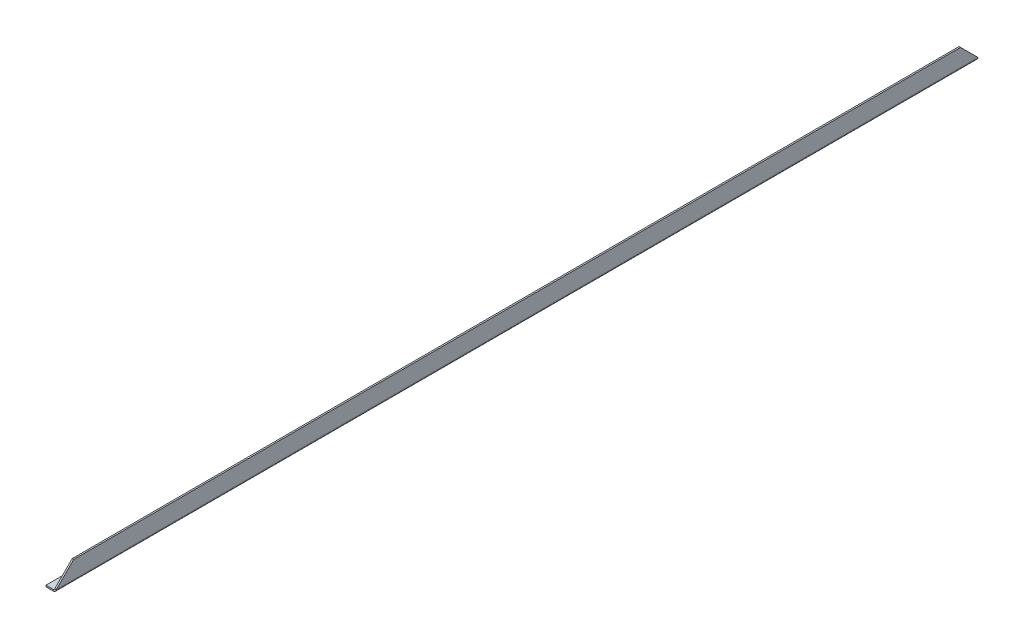
ISO-10303-21;
HEADER;
FILE_DESCRIPTION(('STEP AP214'),'2;1');
FILE_NAME('part.step','',(''),(''),'','','');
FILE_SCHEMA(('AUTOMOTIVE_DESIGN { 1 0 10303 214 1 1 1 1 }'));
ENDSEC;
DATA;
#1=APPLICATION_CONTEXT('core data for automotive mechanical design processes');
#2=APPLICATION_PROTOCOL_DEFINITION('international standard','automotive_design',2000,#1);
#3=PRODUCT_CONTEXT('',#1,'mechanical');
#4=PRODUCT('Part','Part','',(#3));
#5=PRODUCT_RELATED_PRODUCT_CATEGORY('part','',(#4));
#6=PRODUCT_DEFINITION_FORMATION('','',#4);
#7=PRODUCT_DEFINITION_CONTEXT('part definition',#1,'design');
#8=PRODUCT_DEFINITION('design','',#6,#7);
#9=PRODUCT_DEFINITION_SHAPE('','',#8);
#10=(LENGTH_UNIT() NAMED_UNIT(*) SI_UNIT(.MILLI.,.METRE.));
#11=(NAMED_UNIT(*) PLANE_ANGLE_UNIT() SI_UNIT($,.RADIAN.));
#12=(NAMED_UNIT(*) SI_UNIT($,.STERADIAN.) SOLID_ANGLE_UNIT());
#13=UNCERTAINTY_MEASURE_WITH_UNIT(LENGTH_MEASURE(1.E-05),#10,'distance_accuracy_value','');
#14=(GEOMETRIC_REPRESENTATION_CONTEXT(3) GLOBAL_UNCERTAINTY_ASSIGNED_CONTEXT((#13)) GLOBAL_UNIT_ASSIGNED_CONTEXT((#10,
#11,#12)) REPRESENTATION_CONTEXT('',''));
#15=CARTESIAN_POINT('',(0.,0.,0.));
#16=DIRECTION('',(0.,0.,1.));
#17=DIRECTION('',(1.,0.,0.));
#18=AXIS2_PLACEMENT_3D('',#15,#16,#17);
#19=CARTESIAN_POINT('',(1160.00000000001,652.732344202489,69.9999999999998));
#20=DIRECTION('',(1.,0.,0.));
#21=DIRECTION('',(0.,1.,0.));
#22=AXIS2_PLACEMENT_3D('',#19,#20,#21);
#23=PLANE('',#22);
#24=DIRECTION('',(0.,0.,1.));
#25=VECTOR('',#24,1.);
#26=CARTESIAN_POINT('',(1160.,-1198.5,-791.500000000001));
#27=LINE('',#26,#25);
#28=CARTESIAN_POINT('',(1160.,-1198.5,67.7928932188134));
#29=VERTEX_POINT('',#28);
#30=CARTESIAN_POINT('',(1160.,-1198.5,-857.792893218814));
#31=VERTEX_POINT('',#30);
#32=EDGE_CURVE('E170',#29,#31,#27,.F.);
#33=ORIENTED_EDGE('',*,*,#32,.F.);
#34=DIRECTION('',(0.,-1.,0.));
#35=VECTOR('',#34,1.);
#36=CARTESIAN_POINT('',(1160.00000000001,652.732344202489,67.7928932188134));
#37=LINE('',#36,#35);
#38=CARTESIAN_POINT('',(1160.,-1197.,67.7928932188134));
#39=VERTEX_POINT('',#38);
#40=EDGE_CURVE('E172',#39,#29,#37,.T.);
#41=ORIENTED_EDGE('',*,*,#40,.F.);
#42=DIRECTION('',(0.,0.,1.));
#43=VECTOR('',#42,1.);
#44=CARTESIAN_POINT('',(1160.,-1197.,69.9999999999998));
#45=LINE('',#44,#43);
#46=CARTESIAN_POINT('',(1160.,-1197.,-857.792893218814));
#47=VERTEX_POINT('',#46);
#48=EDGE_CURVE('E73',#47,#39,#45,.T.);
#49=ORIENTED_EDGE('',*,*,#48,.F.);
#50=DIRECTION('',(0.,-1.,0.));
#51=VECTOR('',#50,1.);
#52=CARTESIAN_POINT('',(1160.00000000001,652.732344202489,-857.792893218814));
#53=LINE('',#52,#51);
#54=EDGE_CURVE('E184',#47,#31,#53,.T.);
#55=ORIENTED_EDGE('',*,*,#54,.T.);
#56=EDGE_LOOP('',(#33,#41,#49,#55));
#57=FACE_BOUND('',#56,.T.);
#58=ADVANCED_FACE('F59',(#57),#23,.F.);
#59=CARTESIAN_POINT('',(1168.50000000001,652.732344202489,-857.792893218814));
#60=DIRECTION('',(0.,0.,-1.));
#61=DIRECTION('',(1.,0.,0.));
#62=AXIS2_PLACEMENT_3D('',#59,#60,#61);
#63=PLANE('',#62);
#64=CARTESIAN_POINT('',(1167.5,-1198.5,-857.792893218814));
#65=CARTESIAN_POINT('',(1167.5,-1197.,-857.792893218814));
#66=B_SPLINE_CURVE_WITH_KNOTS('',1,(#64,#65),.UNSPECIFIED.,.F.,.F.,(2,2),(0.,1.),.UNSPECIFIED.);
#67=CARTESIAN_POINT('',(1167.5,-1197.,-857.792893218814));
#68=VERTEX_POINT('',#67);
#69=CARTESIAN_POINT('',(1167.5,-1198.5,-857.792893218814));
#70=VERTEX_POINT('',#69);
#71=EDGE_CURVE('E176',#68,#70,#66,.F.);
#72=ORIENTED_EDGE('',*,*,#71,.T.);
#73=DIRECTION('',(1.,0.,0.));
#74=VECTOR('',#73,1.);
#75=CARTESIAN_POINT('',(-3.5527136788005E-12,-1198.5,-857.792893218814));
#76=LINE('',#75,#74);
#77=EDGE_CURVE('E118',#31,#70,#76,.T.);
#78=ORIENTED_EDGE('',*,*,#77,.F.);
#79=ORIENTED_EDGE('',*,*,#54,.F.);
#80=DIRECTION('',(-1.,0.,0.));
#81=VECTOR('',#80,1.);
#82=CARTESIAN_POINT('',(1168.5,-1197.,-857.792893218814));
#83=LINE('',#82,#81);
#84=EDGE_CURVE('E178',#47,#68,#83,.F.);
#85=ORIENTED_EDGE('',*,*,#84,.T.);
#86=EDGE_LOOP('',(#72,#78,#79,#85));
#87=FACE_BOUND('',#86,.T.);
#88=ADVANCED_FACE('F177',(#87),#63,.T.);
#89=CARTESIAN_POINT('',(-3.5527136788005E-12,-1198.5,-791.500000000001));
#90=DIRECTION('',(0.,-1.,0.));
#91=DIRECTION('',(1.,0.,0.));
#92=AXIS2_PLACEMENT_3D('',#89,#90,#91);
#93=PLANE('',#92);
#94=DIRECTION('',(1.,0.,0.));
#95=VECTOR('',#94,1.);
#96=CARTESIAN_POINT('',(-3.5527136788005E-12,-1198.5,67.7928932188134));
#97=LINE('',#96,#95);
#98=CARTESIAN_POINT('',(1167.5,-1198.5,67.7928932188134));
#99=VERTEX_POINT('',#98);
#100=EDGE_CURVE('E378',#99,#29,#97,.F.);
#101=ORIENTED_EDGE('',*,*,#100,.T.);
#102=ORIENTED_EDGE('',*,*,#32,.T.);
#103=ORIENTED_EDGE('',*,*,#77,.T.);
#104=DIRECTION('',(0.,0.,1.));
#105=VECTOR('',#104,1.);
#106=CARTESIAN_POINT('',(1167.5,-1198.5,67.7928932188134));
#107=LINE('',#106,#105);
#108=EDGE_CURVE('E108',#99,#70,#107,.F.);
#109=ORIENTED_EDGE('',*,*,#108,.F.);
#110=EDGE_LOOP('',(#101,#102,#103,#109));
#111=FACE_BOUND('',#110,.T.);
#112=ADVANCED_FACE('F168',(#111),#93,.T.);
#113=CARTESIAN_POINT('',(1168.50000000001,652.732344202489,67.7928932188134));
#114=DIRECTION('',(0.,0.,-1.));
#115=DIRECTION('',(1.,0.,0.));
#116=AXIS2_PLACEMENT_3D('',#113,#114,#115);
#117=PLANE('',#116);
#118=ORIENTED_EDGE('',*,*,#100,.F.);
#119=CARTESIAN_POINT('',(1167.5,-1197.,67.7928932188134));
#120=CARTESIAN_POINT('',(1167.5,-1198.5,67.7928932188134));
#121=B_SPLINE_CURVE_WITH_KNOTS('',1,(#119,#120),.UNSPECIFIED.,.F.,.F.,(2,2),(0.,1.),.UNSPECIFIED.);
#122=CARTESIAN_POINT('',(1167.5,-1197.,67.7928932188134));
#123=VERTEX_POINT('',#122);
#124=EDGE_CURVE('E197',#123,#99,#121,.T.);
#125=ORIENTED_EDGE('',*,*,#124,.F.);
#126=DIRECTION('',(-1.,0.,0.));
#127=VECTOR('',#126,1.);
#128=CARTESIAN_POINT('',(1168.5,-1197.,67.7928932188134));
#129=LINE('',#128,#127);
#130=EDGE_CURVE('E14',#39,#123,#129,.F.);
#131=ORIENTED_EDGE('',*,*,#130,.F.);
#132=ORIENTED_EDGE('',*,*,#40,.T.);
#133=EDGE_LOOP('',(#118,#125,#131,#132));
#134=FACE_BOUND('',#133,.T.);
#135=ADVANCED_FACE('F355',(#134),#117,.F.);
#136=CARTESIAN_POINT('',(-3.5527136788005E-12,-1197.,-791.500000000001));
#137=DIRECTION('',(0.,-1.,0.));
#138=DIRECTION('',(1.,0.,0.));
#139=AXIS2_PLACEMENT_3D('',#136,#137,#138);
#140=PLANE('',#139);
#141=DIRECTION('',(0.,0.,1.));
#142=VECTOR('',#141,1.);
#143=CARTESIAN_POINT('',(1167.5,-1197.,67.7928932188134));
#144=LINE('',#143,#142);
#145=EDGE_CURVE('E372',#123,#68,#144,.F.);
#146=ORIENTED_EDGE('',*,*,#145,.T.);
#147=ORIENTED_EDGE('',*,*,#84,.F.);
#148=ORIENTED_EDGE('',*,*,#48,.T.);
#149=ORIENTED_EDGE('',*,*,#130,.T.);
#150=EDGE_LOOP('',(#146,#147,#148,#149));
#151=FACE_BOUND('',#150,.T.);
#152=ADVANCED_FACE('F62',(#151),#140,.F.);
#153=CARTESIAN_POINT('',(1170.,0.,-791.500000000001));
#154=DIRECTION('',(-1.,0.,0.));
#155=DIRECTION('',(0.,-1.,0.));
#156=AXIS2_PLACEMENT_3D('',#153,#154,#155);
#157=PLANE('',#156);
#158=DIRECTION('',(0.,0.,1.));
#159=VECTOR('',#158,1.);
#160=CARTESIAN_POINT('',(1170.,-1178.5,-791.500000000001));
#161=LINE('',#160,#159);
#162=CARTESIAN_POINT('',(1170.,-1178.5,50.));
#163=VERTEX_POINT('',#162);
#164=CARTESIAN_POINT('',(1170.,-1178.5,-840.000000000001));
#165=VERTEX_POINT('',#164);
#166=EDGE_CURVE('E287',#163,#165,#161,.F.);
#167=ORIENTED_EDGE('',*,*,#166,.F.);
#168=DIRECTION('',(0.,-0.707106781186551,0.707106781186544));
#169=VECTOR('',#168,1.);
#170=CARTESIAN_POINT('',(1170.,-168.499999999994,-959.999999999996));
#171=LINE('',#170,#169);
#172=CARTESIAN_POINT('',(1170.,-1196.,67.4999999999999));
#173=VERTEX_POINT('',#172);
#174=EDGE_CURVE('E296',#163,#173,#171,.T.);
#175=ORIENTED_EDGE('',*,*,#174,.T.);
#176=DIRECTION('',(0.,0.,1.));
#177=VECTOR('',#176,1.);
#178=CARTESIAN_POINT('',(1170.,-1196.,-791.500000000001));
#179=LINE('',#178,#177);
#180=CARTESIAN_POINT('',(1170.,-1196.,-857.5));
#181=VERTEX_POINT('',#180);
#182=EDGE_CURVE('E401',#181,#173,#179,.T.);
#183=ORIENTED_EDGE('',*,*,#182,.F.);
#184=DIRECTION('',(0.,-0.707106781186554,-0.707106781186541));
#185=VECTOR('',#184,1.);
#186=CARTESIAN_POINT('',(1170.,-564.999999999989,-226.500000000001));
#187=LINE('',#186,#185);
#188=EDGE_CURVE('E308',#165,#181,#187,.T.);
#189=ORIENTED_EDGE('',*,*,#188,.F.);
#190=EDGE_LOOP('',(#167,#175,#183,#189));
#191=FACE_BOUND('',#190,.T.);
#192=ADVANCED_FACE('F345',(#191),#157,.F.);
#193=CARTESIAN_POINT('',(-680.33105146079,-168.499999999988,-959.999999999996));
#194=DIRECTION('',(0.,0.707106781186544,0.707106781186551));
#195=DIRECTION('',(0.,-0.707106781186551,0.707106781186544));
#196=AXIS2_PLACEMENT_3D('',#193,#194,#195);
#197=PLANE('',#196);
#198=ORIENTED_EDGE('',*,*,#174,.F.);
#199=DIRECTION('',(1.,0.,0.));
#200=VECTOR('',#199,1.);
#201=CARTESIAN_POINT('',(-680.331051460793,-1178.49999999999,50.));
#202=LINE('',#201,#200);
#203=CARTESIAN_POINT('',(1168.5,-1178.5,50.));
#204=VERTEX_POINT('',#203);
#205=EDGE_CURVE('E303',#204,#163,#202,.T.);
#206=ORIENTED_EDGE('',*,*,#205,.F.);
#207=DIRECTION('',(0.,-0.707106781186551,0.707106781186544));
#208=VECTOR('',#207,1.);
#209=CARTESIAN_POINT('',(1168.5,-168.499999999994,-959.999999999996));
#210=LINE('',#209,#208);
#211=CARTESIAN_POINT('',(1168.5,-1196.,67.4999999999999));
#212=VERTEX_POINT('',#211);
#213=EDGE_CURVE('E299',#204,#212,#210,.T.);
#214=ORIENTED_EDGE('',*,*,#213,.T.);
#215=CARTESIAN_POINT('',(1170.,-1196.,67.4999999999999));
#216=CARTESIAN_POINT('',(1168.5,-1196.,67.4999999999999));
#217=B_SPLINE_CURVE_WITH_KNOTS('',1,(#215,#216),.UNSPECIFIED.,.F.,.F.,(2,2),(0.,1.),.UNSPECIFIED.);
#218=EDGE_CURVE('E275',#212,#173,#217,.F.);
#219=ORIENTED_EDGE('',*,*,#218,.T.);
#220=EDGE_LOOP('',(#198,#206,#214,#219));
#221=FACE_BOUND('',#220,.T.);
#222=ADVANCED_FACE('F334',(#221),#197,.T.);
#223=CARTESIAN_POINT('',(-680.331051460792,-1178.49999999999,-840.000000000001));
#224=DIRECTION('',(0.,-1.,0.));
#225=DIRECTION('',(1.,0.,0.));
#226=AXIS2_PLACEMENT_3D('',#223,#224,#225);
#227=PLANE('',#226);
#228=ORIENTED_EDGE('',*,*,#205,.T.);
#229=ORIENTED_EDGE('',*,*,#166,.T.);
#230=DIRECTION('',(1.,0.,0.));
#231=VECTOR('',#230,1.);
#232=CARTESIAN_POINT('',(-680.331051460793,-1178.49999999999,-840.000000000001));
#233=LINE('',#232,#231);
#234=CARTESIAN_POINT('',(1168.5,-1178.5,-840.000000000001));
#235=VERTEX_POINT('',#234);
#236=EDGE_CURVE('E300',#235,#165,#233,.T.);
#237=ORIENTED_EDGE('',*,*,#236,.F.);
#238=DIRECTION('',(0.,0.,1.));
#239=VECTOR('',#238,1.);
#240=CARTESIAN_POINT('',(1168.5,-1178.5,-840.000000000001));
#241=LINE('',#240,#239);
#242=EDGE_CURVE('E130',#204,#235,#241,.F.);
#243=ORIENTED_EDGE('',*,*,#242,.F.);
#244=EDGE_LOOP('',(#228,#229,#237,#243));
#245=FACE_BOUND('',#244,.T.);
#246=ADVANCED_FACE('F344',(#245),#227,.F.);
#247=CARTESIAN_POINT('',(-680.331051460791,-564.999999999982,-226.500000000001));
#248=DIRECTION('',(0.,-0.707106781186541,0.707106781186554));
#249=DIRECTION('',(0.,-0.707106781186554,-0.707106781186541));
#250=AXIS2_PLACEMENT_3D('',#247,#248,#249);
#251=PLANE('',#250);
#252=ORIENTED_EDGE('',*,*,#236,.T.);
#253=ORIENTED_EDGE('',*,*,#188,.T.);
#254=CARTESIAN_POINT('',(1168.5,-1196.,-857.5));
#255=CARTESIAN_POINT('',(1170.,-1196.,-857.5));
#256=B_SPLINE_CURVE_WITH_KNOTS('',1,(#254,#255),.UNSPECIFIED.,.F.,.F.,(2,2),(0.,1.),.UNSPECIFIED.);
#257=CARTESIAN_POINT('',(1168.5,-1196.,-857.5));
#258=VERTEX_POINT('',#257);
#259=EDGE_CURVE('E201',#258,#181,#256,.T.);
#260=ORIENTED_EDGE('',*,*,#259,.F.);
#261=DIRECTION('',(0.,-0.707106781186554,-0.707106781186541));
#262=VECTOR('',#261,1.);
#263=CARTESIAN_POINT('',(1168.5,-564.999999999989,-226.500000000001));
#264=LINE('',#263,#262);
#265=EDGE_CURVE('E141',#235,#258,#264,.T.);
#266=ORIENTED_EDGE('',*,*,#265,.F.);
#267=EDGE_LOOP('',(#252,#253,#260,#266));
#268=FACE_BOUND('',#267,.T.);
#269=ADVANCED_FACE('F403',(#268),#251,.F.);
#270=CARTESIAN_POINT('',(1168.5,0.,-791.500000000001));
#271=DIRECTION('',(-1.,0.,0.));
#272=DIRECTION('',(0.,-1.,0.));
#273=AXIS2_PLACEMENT_3D('',#270,#271,#272);
#274=PLANE('',#273);
#275=ORIENTED_EDGE('',*,*,#213,.F.);
#276=ORIENTED_EDGE('',*,*,#242,.T.);
#277=ORIENTED_EDGE('',*,*,#265,.T.);
#278=DIRECTION('',(0.,0.,1.));
#279=VECTOR('',#278,1.);
#280=CARTESIAN_POINT('',(1168.5,-1196.,-791.500000000001));
#281=LINE('',#280,#279);
#282=EDGE_CURVE('E311',#258,#212,#281,.T.);
#283=ORIENTED_EDGE('',*,*,#282,.T.);
#284=EDGE_LOOP('',(#275,#276,#277,#283));
#285=FACE_BOUND('',#284,.T.);
#286=ADVANCED_FACE('F412',(#285),#274,.T.);
#287=CARTESIAN_POINT('',(1170.,-1196.,67.4999999999999));
#288=CARTESIAN_POINT('',(1170.,-1196.32730791049,67.5244121445437));
#289=CARTESIAN_POINT('',(1169.93493169167,-1196.6543697109,67.5488155364688));
#290=CARTESIAN_POINT('',(1169.68446597088,-1197.25904745093,67.5976310729377));
#291=CARTESIAN_POINT('',(1169.49916710599,-1197.53636679994,67.6220388411722));
#292=CARTESIAN_POINT('',(1169.03636679994,-1197.999167106,67.6708543776411));
#293=CARTESIAN_POINT('',(1168.75904745093,-1198.18446597089,67.6952621458756));
#294=CARTESIAN_POINT('',(1168.1543697109,-1198.43493169167,67.7440776823445));
#295=CARTESIAN_POINT('',(1167.82730791049,-1198.5,67.7684810742697));
#296=CARTESIAN_POINT('',(1167.5,-1198.5,67.7928932188134));
#297=CARTESIAN_POINT('',(1168.5,-1196.,67.4999999999999));
#298=CARTESIAN_POINT('',(1168.5,-1196.13092250178,67.5244120210277));
#299=CARTESIAN_POINT('',(1168.47397267667,-1196.26174788436,67.5488155364688));
#300=CARTESIAN_POINT('',(1168.37378638835,-1196.50361898037,67.5976310729377));
#301=CARTESIAN_POINT('',(1168.2996668424,-1196.61454671997,67.6220388411722));
#302=CARTESIAN_POINT('',(1168.11454671997,-1196.7996668424,67.6708543776411));
#303=CARTESIAN_POINT('',(1168.00361898037,-1196.87378638835,67.6952621458756));
#304=CARTESIAN_POINT('',(1167.76174788436,-1196.97397267667,67.7440776823445));
#305=CARTESIAN_POINT('',(1167.63092250177,-1197.,67.7684811977857));
#306=CARTESIAN_POINT('',(1167.5,-1197.,67.7928932188134));
#307=B_SPLINE_SURFACE_WITH_KNOTS('',1,3,((#287,#288,#289,#290,#291,#292,#293,#294,#295,#296),
(#297,#298,#299,#300,#301,#302,#303,#304,#305,#306)),.UNSPECIFIED.,.F.,.F.,.F.,(2,2),(4,2,2,2,
4),(0.,1.),(0.,0.25,0.5,0.75,1.),.UNSPECIFIED.);
#308=CARTESIAN_POINT('',(1168.5,-1196.,67.4999999999999));
#309=CARTESIAN_POINT('',(1168.5,-1196.13092250178,67.5244120210277));
#310=CARTESIAN_POINT('',(1168.47397267667,-1196.26174788436,67.5488155364688));
#311=CARTESIAN_POINT('',(1168.37378638835,-1196.50361898037,67.5976310729377));
#312=CARTESIAN_POINT('',(1168.2996668424,-1196.61454671997,67.6220388411722));
#313=CARTESIAN_POINT('',(1168.11454671997,-1196.7996668424,67.6708543776411));
#314=CARTESIAN_POINT('',(1168.00361898037,-1196.87378638835,67.6952621458756));
#315=CARTESIAN_POINT('',(1167.76174788436,-1196.97397267667,67.7440776823445));
#316=CARTESIAN_POINT('',(1167.63092250177,-1197.,67.7684811977857));
#317=CARTESIAN_POINT('',(1167.5,-1197.,67.7928932188134));
#318=B_SPLINE_CURVE_WITH_KNOTS('',3,(#308,#309,#310,#311,#312,#313,#314,#315,#316,#317),
.UNSPECIFIED.,.F.,.F.,(4,2,2,2,4),(0.,0.25,0.5,0.75,1.),.UNSPECIFIED.);
#319=EDGE_CURVE('E204',#212,#123,#318,.T.);
#320=CARTESIAN_POINT('',(1167.5,-1198.5,67.7928932188134));
#321=CARTESIAN_POINT('',(1167.82730791049,-1198.5,67.7684810742697));
#322=CARTESIAN_POINT('',(1168.1543697109,-1198.43493169167,67.7440776823445));
#323=CARTESIAN_POINT('',(1168.75904745093,-1198.18446597089,67.6952621458756));
#324=CARTESIAN_POINT('',(1169.03636679994,-1197.999167106,67.6708543776411));
#325=CARTESIAN_POINT('',(1169.49916710599,-1197.53636679994,67.6220388411722));
#326=CARTESIAN_POINT('',(1169.68446597088,-1197.25904745093,67.5976310729377));
#327=CARTESIAN_POINT('',(1169.93493169167,-1196.6543697109,67.5488155364688));
#328=CARTESIAN_POINT('',(1170.,-1196.32730791049,67.5244121445437));
#329=CARTESIAN_POINT('',(1170.,-1196.,67.4999999999999));
#330=B_SPLINE_CURVE_WITH_KNOTS('',3,(#320,#321,#322,#323,#324,#325,#326,#327,#328,#329),
.UNSPECIFIED.,.F.,.F.,(4,2,2,2,4),(0.,0.25,0.5,0.75,1.),.UNSPECIFIED.);
#331=EDGE_CURVE('E194',#173,#99,#330,.F.);
#332=ORIENTED_EDGE('',*,*,#218,.F.);
#333=ORIENTED_EDGE('',*,*,#319,.T.);
#334=ORIENTED_EDGE('',*,*,#124,.T.);
#335=ORIENTED_EDGE('',*,*,#331,.F.);
#336=EDGE_LOOP('',(#332,#333,#334,#335));
#337=FACE_BOUND('',#336,.T.);
#338=ADVANCED_FACE('F229',(#337),#307,.T.);
#339=CARTESIAN_POINT('',(1167.5,-1198.5,-857.792893218814));
#340=CARTESIAN_POINT('',(1167.82730791049,-1198.5,-857.76848107427));
#341=CARTESIAN_POINT('',(1168.1543697109,-1198.43493169167,-857.744077682345));
#342=CARTESIAN_POINT('',(1168.75904745093,-1198.18446597089,-857.695262145876));
#343=CARTESIAN_POINT('',(1169.03636679994,-1197.999167106,-857.670854377641));
#344=CARTESIAN_POINT('',(1169.49916710599,-1197.53636679994,-857.622038841173));
#345=CARTESIAN_POINT('',(1169.68446597088,-1197.25904745093,-857.597631072938));
#346=CARTESIAN_POINT('',(1169.93493169167,-1196.6543697109,-857.548815536469));
#347=CARTESIAN_POINT('',(1170.,-1196.32730791049,-857.524412144544));
#348=CARTESIAN_POINT('',(1170.,-1196.,-857.5));
#349=CARTESIAN_POINT('',(1167.5,-1197.,-857.792893218814));
#350=CARTESIAN_POINT('',(1167.63092250177,-1197.,-857.768481197786));
#351=CARTESIAN_POINT('',(1167.76174788436,-1196.97397267667,-857.744077682345));
#352=CARTESIAN_POINT('',(1168.00361898037,-1196.87378638835,-857.695262145876));
#353=CARTESIAN_POINT('',(1168.11454671997,-1196.7996668424,-857.670854377641));
#354=CARTESIAN_POINT('',(1168.2996668424,-1196.61454671997,-857.622038841173));
#355=CARTESIAN_POINT('',(1168.37378638835,-1196.50361898037,-857.597631072938));
#356=CARTESIAN_POINT('',(1168.47397267667,-1196.26174788436,-857.548815536469));
#357=CARTESIAN_POINT('',(1168.5,-1196.13092250178,-857.524412021028));
#358=CARTESIAN_POINT('',(1168.5,-1196.,-857.5));
#359=B_SPLINE_SURFACE_WITH_KNOTS('',1,3,((#339,#340,#341,#342,#343,#344,#345,#346,#347,#348),
(#349,#350,#351,#352,#353,#354,#355,#356,#357,#358)),.UNSPECIFIED.,.F.,.F.,.F.,(2,2),(4,2,2,2,
4),(0.,1.),(0.,0.25,0.5,0.75,1.),.UNSPECIFIED.);
#360=CARTESIAN_POINT('',(1167.5,-1197.,-857.792893218814));
#361=CARTESIAN_POINT('',(1167.63092250177,-1197.,-857.768481197786));
#362=CARTESIAN_POINT('',(1167.76174788436,-1196.97397267667,-857.744077682345));
#363=CARTESIAN_POINT('',(1168.00361898037,-1196.87378638835,-857.695262145876));
#364=CARTESIAN_POINT('',(1168.11454671997,-1196.7996668424,-857.670854377641));
#365=CARTESIAN_POINT('',(1168.2996668424,-1196.61454671997,-857.622038841173));
#366=CARTESIAN_POINT('',(1168.37378638835,-1196.50361898037,-857.597631072938));
#367=CARTESIAN_POINT('',(1168.47397267667,-1196.26174788436,-857.548815536469));
#368=CARTESIAN_POINT('',(1168.5,-1196.13092250178,-857.524412021028));
#369=CARTESIAN_POINT('',(1168.5,-1196.,-857.5));
#370=B_SPLINE_CURVE_WITH_KNOTS('',3,(#360,#361,#362,#363,#364,#365,#366,#367,#368,#369),
.UNSPECIFIED.,.F.,.F.,(4,2,2,2,4),(0.,0.25,0.5,0.75,1.),.UNSPECIFIED.);
#371=EDGE_CURVE('E590',#68,#258,#370,.T.);
#372=CARTESIAN_POINT('',(1170.,-1196.,-857.5));
#373=CARTESIAN_POINT('',(1170.,-1196.32730791049,-857.524412144544));
#374=CARTESIAN_POINT('',(1169.93493169167,-1196.6543697109,-857.548815536469));
#375=CARTESIAN_POINT('',(1169.68446597088,-1197.25904745093,-857.597631072938));
#376=CARTESIAN_POINT('',(1169.49916710599,-1197.53636679994,-857.622038841173));
#377=CARTESIAN_POINT('',(1169.03636679994,-1197.999167106,-857.670854377641));
#378=CARTESIAN_POINT('',(1168.75904745093,-1198.18446597089,-857.695262145876));
#379=CARTESIAN_POINT('',(1168.1543697109,-1198.43493169167,-857.744077682345));
#380=CARTESIAN_POINT('',(1167.82730791049,-1198.5,-857.76848107427));
#381=CARTESIAN_POINT('',(1167.5,-1198.5,-857.792893218814));
#382=B_SPLINE_CURVE_WITH_KNOTS('',3,(#372,#373,#374,#375,#376,#377,#378,#379,#380,#381),
.UNSPECIFIED.,.F.,.F.,(4,2,2,2,4),(0.,0.25,0.5,0.75,1.),.UNSPECIFIED.);
#383=EDGE_CURVE('E191',#70,#181,#382,.F.);
#384=ORIENTED_EDGE('',*,*,#71,.F.);
#385=ORIENTED_EDGE('',*,*,#371,.T.);
#386=ORIENTED_EDGE('',*,*,#259,.T.);
#387=ORIENTED_EDGE('',*,*,#383,.F.);
#388=EDGE_LOOP('',(#384,#385,#386,#387));
#389=FACE_BOUND('',#388,.T.);
#390=ADVANCED_FACE('F200',(#389),#359,.T.);
#391=CARTESIAN_POINT('',(1167.5,-1196.,-1783.64188291315));
#392=DIRECTION('',(0.,0.,1.));
#393=DIRECTION('',(1.,0.,0.));
#394=AXIS2_PLACEMENT_3D('',#391,#392,#393);
#395=CYLINDRICAL_SURFACE('',#394,2.49999999999972);
#396=ORIENTED_EDGE('',*,*,#383,.T.);
#397=ORIENTED_EDGE('',*,*,#182,.T.);
#398=ORIENTED_EDGE('',*,*,#331,.T.);
#399=ORIENTED_EDGE('',*,*,#108,.T.);
#400=EDGE_LOOP('',(#396,#397,#398,#399));
#401=FACE_BOUND('',#400,.T.);
#402=ADVANCED_FACE('F189',(#401),#395,.T.);
#403=CARTESIAN_POINT('',(1167.5,-1196.,-1783.64188291315));
#404=DIRECTION('',(0.,0.,1.));
#405=DIRECTION('',(1.,0.,0.));
#406=AXIS2_PLACEMENT_3D('',#403,#404,#405);
#407=CYLINDRICAL_SURFACE('',#406,0.999999999999667);
#408=ORIENTED_EDGE('',*,*,#371,.F.);
#409=ORIENTED_EDGE('',*,*,#145,.F.);
#410=ORIENTED_EDGE('',*,*,#319,.F.);
#411=ORIENTED_EDGE('',*,*,#282,.F.);
#412=EDGE_LOOP('',(#408,#409,#410,#411));
#413=FACE_BOUND('',#412,.T.);
#414=ADVANCED_FACE('F231',(#413),#407,.F.);
#415=CLOSED_SHELL('',(#58,#88,#112,#135,#152,#192,#222,#246,#269,#286,#338,#390,#402,#414));
#416=MANIFOLD_SOLID_BREP('B2',#415);
#417=ADVANCED_BREP_SHAPE_REPRESENTATION('',(#18,#416),#14);
#418=SHAPE_DEFINITION_REPRESENTATION(#9,#417);
ENDSEC;
END-ISO-10303-21;
